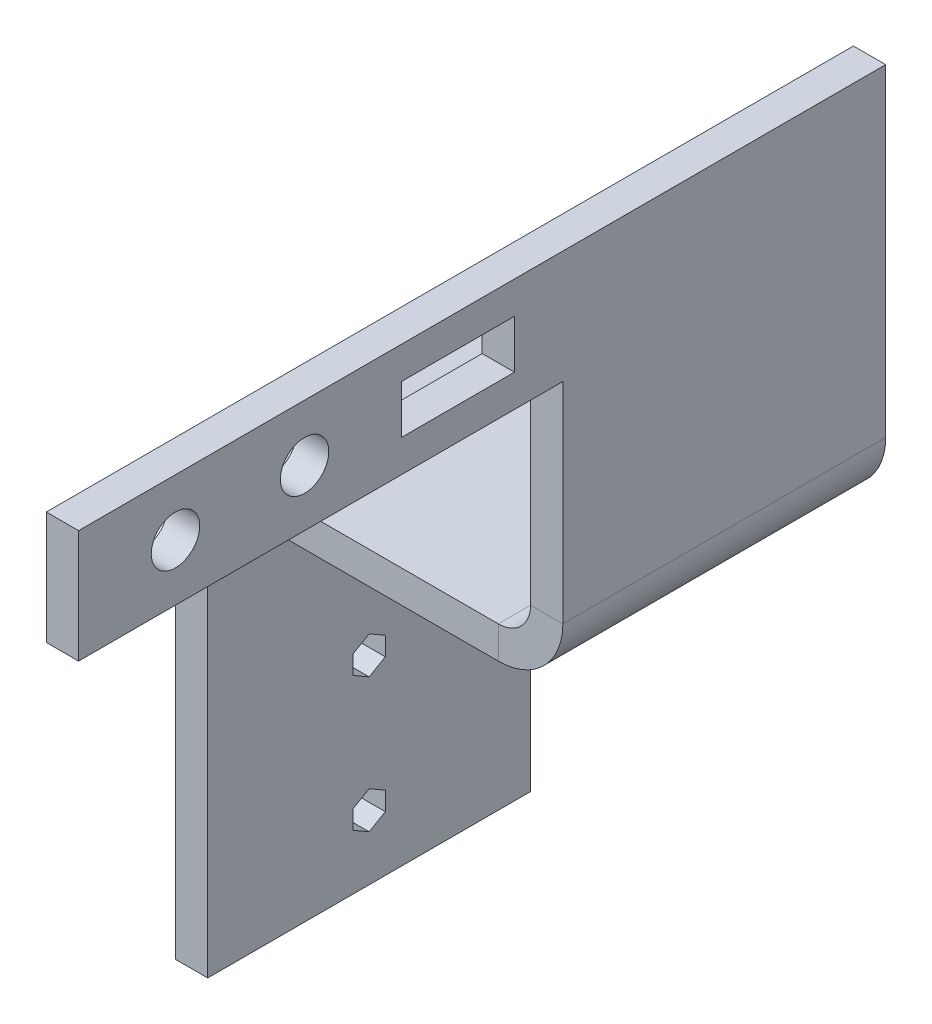
ISO-10303-21;
HEADER;
FILE_DESCRIPTION(('STEP AP214'),'2;1');
FILE_NAME('part.step','',(''),(''),'','','');
FILE_SCHEMA(('AUTOMOTIVE_DESIGN { 1 0 10303 214 1 1 1 1 }'));
ENDSEC;
DATA;
#1=APPLICATION_CONTEXT('core data for automotive mechanical design processes');
#2=APPLICATION_PROTOCOL_DEFINITION('international standard','automotive_design',2000,#1);
#3=PRODUCT_CONTEXT('',#1,'mechanical');
#4=PRODUCT('Part','Part','',(#3));
#5=PRODUCT_RELATED_PRODUCT_CATEGORY('part','',(#4));
#6=PRODUCT_DEFINITION_FORMATION('','',#4);
#7=PRODUCT_DEFINITION_CONTEXT('part definition',#1,'design');
#8=PRODUCT_DEFINITION('design','',#6,#7);
#9=PRODUCT_DEFINITION_SHAPE('','',#8);
#10=(LENGTH_UNIT() NAMED_UNIT(*) SI_UNIT(.MILLI.,.METRE.));
#11=(NAMED_UNIT(*) PLANE_ANGLE_UNIT() SI_UNIT($,.RADIAN.));
#12=(NAMED_UNIT(*) SI_UNIT($,.STERADIAN.) SOLID_ANGLE_UNIT());
#13=UNCERTAINTY_MEASURE_WITH_UNIT(LENGTH_MEASURE(1.E-05),#10,'distance_accuracy_value','');
#14=(GEOMETRIC_REPRESENTATION_CONTEXT(3) GLOBAL_UNCERTAINTY_ASSIGNED_CONTEXT((#13)) GLOBAL_UNIT_ASSIGNED_CONTEXT((#10,
#11,#12)) REPRESENTATION_CONTEXT('',''));
#15=CARTESIAN_POINT('',(0.,0.,0.));
#16=DIRECTION('',(0.,0.,1.));
#17=DIRECTION('',(1.,0.,0.));
#18=AXIS2_PLACEMENT_3D('',#15,#16,#17);
#19=CARTESIAN_POINT('',(12.,0.,10.));
#20=DIRECTION('',(0.,0.,1.));
#21=DIRECTION('',(1.,0.,0.));
#22=AXIS2_PLACEMENT_3D('',#19,#20,#21);
#23=PLANE('',#22);
#24=DIRECTION('',(0.,1.,0.));
#25=VECTOR('',#24,1.);
#26=CARTESIAN_POINT('',(1.,0.,10.));
#27=LINE('',#26,#25);
#28=CARTESIAN_POINT('',(1.,0.,10.));
#29=VERTEX_POINT('',#28);
#30=CARTESIAN_POINT('',(1.,12.,10.));
#31=VERTEX_POINT('',#30);
#32=EDGE_CURVE('E365',#29,#31,#27,.T.);
#33=ORIENTED_EDGE('',*,*,#32,.T.);
#34=DIRECTION('',(-1.,0.,0.));
#35=VECTOR('',#34,1.);
#36=CARTESIAN_POINT('',(1.,12.,10.));
#37=LINE('',#36,#35);
#38=CARTESIAN_POINT('',(0.,12.,10.));
#39=VERTEX_POINT('',#38);
#40=EDGE_CURVE('E474',#31,#39,#37,.T.);
#41=ORIENTED_EDGE('',*,*,#40,.T.);
#42=DIRECTION('',(0.,1.,0.));
#43=VECTOR('',#42,1.);
#44=CARTESIAN_POINT('',(0.,0.,10.));
#45=LINE('',#44,#43);
#46=CARTESIAN_POINT('',(0.,0.,10.));
#47=VERTEX_POINT('',#46);
#48=EDGE_CURVE('E368',#47,#39,#45,.T.);
#49=ORIENTED_EDGE('',*,*,#48,.F.);
#50=DIRECTION('',(-1.,0.,0.));
#51=VECTOR('',#50,1.);
#52=CARTESIAN_POINT('',(12.,0.,10.));
#53=LINE('',#52,#51);
#54=EDGE_CURVE('E356',#29,#47,#53,.T.);
#55=ORIENTED_EDGE('',*,*,#54,.F.);
#56=EDGE_LOOP('',(#33,#41,#49,#55));
#57=FACE_BOUND('',#56,.T.);
#58=ADVANCED_FACE('F43',(#57),#23,.T.);
#59=DIRECTION('',(1.,0.,0.));
#60=VECTOR('',#59,1.);
#61=CARTESIAN_POINT('',(0.,14.,10.));
#62=LINE('',#61,#60);
#63=CARTESIAN_POINT('',(2.,14.,10.));
#64=VERTEX_POINT('',#63);
#65=CARTESIAN_POINT('',(10.,14.,10.));
#66=VERTEX_POINT('',#65);
#67=EDGE_CURVE('E374',#64,#66,#62,.T.);
#68=ORIENTED_EDGE('',*,*,#67,.F.);
#69=DIRECTION('',(0.,-1.,0.));
#70=VECTOR('',#69,1.);
#71=CARTESIAN_POINT('',(2.,14.,10.));
#72=LINE('',#71,#70);
#73=CARTESIAN_POINT('',(2.,13.,10.));
#74=VERTEX_POINT('',#73);
#75=EDGE_CURVE('E472',#64,#74,#72,.T.);
#76=ORIENTED_EDGE('',*,*,#75,.T.);
#77=DIRECTION('',(1.,0.,0.));
#78=VECTOR('',#77,1.);
#79=CARTESIAN_POINT('',(0.,13.,10.));
#80=LINE('',#79,#78);
#81=CARTESIAN_POINT('',(10.,13.,10.));
#82=VERTEX_POINT('',#81);
#83=EDGE_CURVE('E359',#74,#82,#80,.T.);
#84=ORIENTED_EDGE('',*,*,#83,.T.);
#85=DIRECTION('',(0.,1.,0.));
#86=VECTOR('',#85,1.);
#87=CARTESIAN_POINT('',(10.,13.,10.));
#88=LINE('',#87,#86);
#89=EDGE_CURVE('E470',#82,#66,#88,.T.);
#90=ORIENTED_EDGE('',*,*,#89,.T.);
#91=EDGE_LOOP('',(#68,#76,#84,#90));
#92=FACE_BOUND('',#91,.T.);
#93=ADVANCED_FACE('F539',(#92),#23,.T.);
#94=ORIENTED_EDGE('',*,*,#40,.F.);
#95=CARTESIAN_POINT('',(2.,12.,10.));
#96=DIRECTION('',(0.,0.,1.));
#97=DIRECTION('',(1.,0.,0.));
#98=AXIS2_PLACEMENT_3D('',#95,#96,#97);
#99=CIRCLE('',#98,1.);
#100=EDGE_CURVE('E362',#31,#74,#99,.F.);
#101=ORIENTED_EDGE('',*,*,#100,.T.);
#102=ORIENTED_EDGE('',*,*,#75,.F.);
#103=CARTESIAN_POINT('',(2.,12.,10.));
#104=DIRECTION('',(0.,0.,1.));
#105=DIRECTION('',(1.,0.,0.));
#106=AXIS2_PLACEMENT_3D('',#103,#104,#105);
#107=CIRCLE('',#106,2.);
#108=EDGE_CURVE('E371',#39,#64,#107,.F.);
#109=ORIENTED_EDGE('',*,*,#108,.F.);
#110=EDGE_LOOP('',(#94,#101,#102,#109));
#111=FACE_BOUND('',#110,.T.);
#112=ADVANCED_FACE('F547',(#111),#23,.T.);
#113=DIRECTION('',(0.,1.,0.));
#114=VECTOR('',#113,1.);
#115=CARTESIAN_POINT('',(11.,14.,10.));
#116=LINE('',#115,#114);
#117=CARTESIAN_POINT('',(11.,15.,10.));
#118=VERTEX_POINT('',#117);
#119=CARTESIAN_POINT('',(11.,21.5,10.));
#120=VERTEX_POINT('',#119);
#121=EDGE_CURVE('E380',#118,#120,#116,.T.);
#122=ORIENTED_EDGE('',*,*,#121,.F.);
#123=DIRECTION('',(1.,0.,0.));
#124=VECTOR('',#123,1.);
#125=CARTESIAN_POINT('',(11.,15.,10.));
#126=LINE('',#125,#124);
#127=CARTESIAN_POINT('',(12.,15.,10.));
#128=VERTEX_POINT('',#127);
#129=EDGE_CURVE('E468',#118,#128,#126,.T.);
#130=ORIENTED_EDGE('',*,*,#129,.T.);
#131=DIRECTION('',(0.,1.,0.));
#132=VECTOR('',#131,1.);
#133=CARTESIAN_POINT('',(12.,0.,10.));
#134=LINE('',#133,#132);
#135=CARTESIAN_POINT('',(12.,21.5,10.));
#136=VERTEX_POINT('',#135);
#137=EDGE_CURVE('E347',#128,#136,#134,.T.);
#138=ORIENTED_EDGE('',*,*,#137,.T.);
#139=DIRECTION('',(-1.,0.,0.));
#140=VECTOR('',#139,1.);
#141=CARTESIAN_POINT('',(12.,21.5,10.));
#142=LINE('',#141,#140);
#143=EDGE_CURVE('E353',#136,#120,#142,.T.);
#144=ORIENTED_EDGE('',*,*,#143,.T.);
#145=EDGE_LOOP('',(#122,#130,#138,#144));
#146=FACE_BOUND('',#145,.T.);
#147=ADVANCED_FACE('F555',(#146),#23,.T.);
#148=CARTESIAN_POINT('',(10.,13.,25.));
#149=DIRECTION('',(0.,0.,1.));
#150=DIRECTION('',(1.,0.,0.));
#151=AXIS2_PLACEMENT_3D('',#148,#149,#150);
#152=PLANE('',#151);
#153=DIRECTION('',(0.,1.,0.));
#154=VECTOR('',#153,1.);
#155=CARTESIAN_POINT('',(11.,14.,25.));
#156=LINE('',#155,#154);
#157=CARTESIAN_POINT('',(11.,21.5,25.));
#158=VERTEX_POINT('',#157);
#159=CARTESIAN_POINT('',(11.,25.,25.));
#160=VERTEX_POINT('',#159);
#161=EDGE_CURVE('E390',#158,#160,#156,.T.);
#162=ORIENTED_EDGE('',*,*,#161,.F.);
#163=DIRECTION('',(-1.,0.,0.));
#164=VECTOR('',#163,1.);
#165=CARTESIAN_POINT('',(12.,21.5,25.));
#166=LINE('',#165,#164);
#167=CARTESIAN_POINT('',(12.,21.5,25.));
#168=VERTEX_POINT('',#167);
#169=EDGE_CURVE('E351',#168,#158,#166,.T.);
#170=ORIENTED_EDGE('',*,*,#169,.F.);
#171=DIRECTION('',(0.,1.,0.));
#172=VECTOR('',#171,1.);
#173=CARTESIAN_POINT('',(12.,14.,25.));
#174=LINE('',#173,#172);
#175=CARTESIAN_POINT('',(12.,25.,25.));
#176=VERTEX_POINT('',#175);
#177=EDGE_CURVE('E384',#168,#176,#174,.T.);
#178=ORIENTED_EDGE('',*,*,#177,.T.);
#179=DIRECTION('',(1.,0.,0.));
#180=VECTOR('',#179,1.);
#181=CARTESIAN_POINT('',(11.,25.,25.));
#182=LINE('',#181,#180);
#183=EDGE_CURVE('E386',#160,#176,#182,.T.);
#184=ORIENTED_EDGE('',*,*,#183,.F.);
#185=EDGE_LOOP('',(#162,#170,#178,#184));
#186=FACE_BOUND('',#185,.T.);
#187=ADVANCED_FACE('F565',(#186),#152,.T.);
#188=CARTESIAN_POINT('',(12.,14.,25.));
#189=DIRECTION('',(-1.,0.,0.));
#190=DIRECTION('',(0.,0.,1.));
#191=AXIS2_PLACEMENT_3D('',#188,#189,#190);
#192=PLANE('',#191);
#193=CARTESIAN_POINT('',(12.,23.25,22.));
#194=DIRECTION('',(-1.,0.,0.));
#195=DIRECTION('',(0.,0.,1.));
#196=AXIS2_PLACEMENT_3D('',#193,#194,#195);
#197=CIRCLE('',#196,0.750000000000002);
#198=CARTESIAN_POINT('',(12.,23.25,22.75));
#199=VERTEX_POINT('',#198);
#200=EDGE_CURVE('E344',#199,#199,#197,.T.);
#201=ORIENTED_EDGE('',*,*,#200,.T.);
#202=EDGE_LOOP('',(#201));
#203=FACE_BOUND('',#202,.T.);
#204=CARTESIAN_POINT('',(12.,23.25,18.));
#205=DIRECTION('',(-1.,0.,0.));
#206=DIRECTION('',(0.,0.,1.));
#207=AXIS2_PLACEMENT_3D('',#204,#205,#206);
#208=CIRCLE('',#207,0.750000000000002);
#209=CARTESIAN_POINT('',(12.,23.25,18.75));
#210=VERTEX_POINT('',#209);
#211=EDGE_CURVE('E340',#210,#210,#208,.T.);
#212=ORIENTED_EDGE('',*,*,#211,.T.);
#213=EDGE_LOOP('',(#212));
#214=FACE_BOUND('',#213,.T.);
#215=DIRECTION('',(0.,1.,0.));
#216=VECTOR('',#215,1.);
#217=CARTESIAN_POINT('',(12.,14.,15.));
#218=LINE('',#217,#216);
#219=CARTESIAN_POINT('',(12.,22.5,15.));
#220=VERTEX_POINT('',#219);
#221=CARTESIAN_POINT('',(12.,24.,15.));
#222=VERTEX_POINT('',#221);
#223=EDGE_CURVE('E319',#220,#222,#218,.T.);
#224=ORIENTED_EDGE('',*,*,#223,.T.);
#225=DIRECTION('',(0.,0.,-1.));
#226=VECTOR('',#225,1.);
#227=CARTESIAN_POINT('',(12.,24.,25.));
#228=LINE('',#227,#226);
#229=CARTESIAN_POINT('',(12.,24.,11.5));
#230=VERTEX_POINT('',#229);
#231=EDGE_CURVE('E336',#222,#230,#228,.T.);
#232=ORIENTED_EDGE('',*,*,#231,.T.);
#233=DIRECTION('',(0.,-1.,0.));
#234=VECTOR('',#233,1.);
#235=CARTESIAN_POINT('',(12.,14.,11.5));
#236=LINE('',#235,#234);
#237=CARTESIAN_POINT('',(12.,22.5,11.5));
#238=VERTEX_POINT('',#237);
#239=EDGE_CURVE('E333',#230,#238,#236,.T.);
#240=ORIENTED_EDGE('',*,*,#239,.T.);
#241=DIRECTION('',(0.,0.,1.));
#242=VECTOR('',#241,1.);
#243=CARTESIAN_POINT('',(12.,22.5,25.));
#244=LINE('',#243,#242);
#245=EDGE_CURVE('E330',#238,#220,#244,.T.);
#246=ORIENTED_EDGE('',*,*,#245,.T.);
#247=EDGE_LOOP('',(#224,#232,#240,#246));
#248=FACE_BOUND('',#247,.T.);
#249=ORIENTED_EDGE('',*,*,#137,.F.);
#250=DIRECTION('',(0.,0.,-1.));
#251=VECTOR('',#250,1.);
#252=CARTESIAN_POINT('',(12.,15.,25.));
#253=LINE('',#252,#251);
#254=CARTESIAN_POINT('',(12.,15.,0.));
#255=VERTEX_POINT('',#254);
#256=EDGE_CURVE('E392',#128,#255,#253,.T.);
#257=ORIENTED_EDGE('',*,*,#256,.T.);
#258=DIRECTION('',(0.,1.,0.));
#259=VECTOR('',#258,1.);
#260=CARTESIAN_POINT('',(12.,14.,0.));
#261=LINE('',#260,#259);
#262=CARTESIAN_POINT('',(12.,25.,0.));
#263=VERTEX_POINT('',#262);
#264=EDGE_CURVE('E383',#255,#263,#261,.T.);
#265=ORIENTED_EDGE('',*,*,#264,.T.);
#266=DIRECTION('',(0.,0.,-1.));
#267=VECTOR('',#266,1.);
#268=CARTESIAN_POINT('',(12.,25.,25.));
#269=LINE('',#268,#267);
#270=EDGE_CURVE('E448',#176,#263,#269,.T.);
#271=ORIENTED_EDGE('',*,*,#270,.F.);
#272=ORIENTED_EDGE('',*,*,#177,.F.);
#273=DIRECTION('',(0.,0.,1.));
#274=VECTOR('',#273,1.);
#275=CARTESIAN_POINT('',(12.,21.5,25.));
#276=LINE('',#275,#274);
#277=EDGE_CURVE('E349',#136,#168,#276,.T.);
#278=ORIENTED_EDGE('',*,*,#277,.F.);
#279=EDGE_LOOP('',(#249,#257,#265,#271,#272,#278));
#280=FACE_BOUND('',#279,.T.);
#281=ADVANCED_FACE('F571',(#203,#214,#248,#280),#192,.F.);
#282=CARTESIAN_POINT('',(11.,14.,25.));
#283=DIRECTION('',(-1.,0.,0.));
#284=DIRECTION('',(0.,0.,1.));
#285=AXIS2_PLACEMENT_3D('',#282,#283,#284);
#286=PLANE('',#285);
#287=CARTESIAN_POINT('',(11.,23.25,22.));
#288=DIRECTION('',(-1.,0.,0.));
#289=DIRECTION('',(0.,0.,1.));
#290=AXIS2_PLACEMENT_3D('',#287,#288,#289);
#291=CIRCLE('',#290,0.750000000000002);
#292=CARTESIAN_POINT('',(11.,23.25,22.75));
#293=VERTEX_POINT('',#292);
#294=EDGE_CURVE('E343',#293,#293,#291,.T.);
#295=ORIENTED_EDGE('',*,*,#294,.F.);
#296=EDGE_LOOP('',(#295));
#297=FACE_BOUND('',#296,.T.);
#298=CARTESIAN_POINT('',(11.,23.25,18.));
#299=DIRECTION('',(-1.,0.,0.));
#300=DIRECTION('',(0.,0.,1.));
#301=AXIS2_PLACEMENT_3D('',#298,#299,#300);
#302=CIRCLE('',#301,0.750000000000002);
#303=CARTESIAN_POINT('',(11.,23.25,18.75));
#304=VERTEX_POINT('',#303);
#305=EDGE_CURVE('E339',#304,#304,#302,.T.);
#306=ORIENTED_EDGE('',*,*,#305,.F.);
#307=EDGE_LOOP('',(#306));
#308=FACE_BOUND('',#307,.T.);
#309=DIRECTION('',(0.,0.,-1.));
#310=VECTOR('',#309,1.);
#311=CARTESIAN_POINT('',(11.,24.,25.));
#312=LINE('',#311,#310);
#313=CARTESIAN_POINT('',(11.,24.,15.));
#314=VERTEX_POINT('',#313);
#315=CARTESIAN_POINT('',(11.,24.,11.5));
#316=VERTEX_POINT('',#315);
#317=EDGE_CURVE('E483',#314,#316,#312,.T.);
#318=ORIENTED_EDGE('',*,*,#317,.F.);
#319=DIRECTION('',(0.,1.,0.));
#320=VECTOR('',#319,1.);
#321=CARTESIAN_POINT('',(11.,14.,15.));
#322=LINE('',#321,#320);
#323=CARTESIAN_POINT('',(11.,22.5,15.));
#324=VERTEX_POINT('',#323);
#325=EDGE_CURVE('E476',#324,#314,#322,.T.);
#326=ORIENTED_EDGE('',*,*,#325,.F.);
#327=DIRECTION('',(0.,0.,1.));
#328=VECTOR('',#327,1.);
#329=CARTESIAN_POINT('',(11.,22.5,25.));
#330=LINE('',#329,#328);
#331=CARTESIAN_POINT('',(11.,22.5,11.5));
#332=VERTEX_POINT('',#331);
#333=EDGE_CURVE('E478',#332,#324,#330,.T.);
#334=ORIENTED_EDGE('',*,*,#333,.F.);
#335=DIRECTION('',(0.,-1.,0.));
#336=VECTOR('',#335,1.);
#337=CARTESIAN_POINT('',(11.,14.,11.5));
#338=LINE('',#337,#336);
#339=EDGE_CURVE('E481',#316,#332,#338,.T.);
#340=ORIENTED_EDGE('',*,*,#339,.F.);
#341=EDGE_LOOP('',(#318,#326,#334,#340));
#342=FACE_BOUND('',#341,.T.);
#343=DIRECTION('',(0.,0.,-1.));
#344=VECTOR('',#343,1.);
#345=CARTESIAN_POINT('',(11.,15.,25.));
#346=LINE('',#345,#344);
#347=CARTESIAN_POINT('',(11.,15.,0.));
#348=VERTEX_POINT('',#347);
#349=EDGE_CURVE('E444',#118,#348,#346,.T.);
#350=ORIENTED_EDGE('',*,*,#349,.F.);
#351=ORIENTED_EDGE('',*,*,#121,.T.);
#352=DIRECTION('',(0.,0.,1.));
#353=VECTOR('',#352,1.);
#354=CARTESIAN_POINT('',(11.,21.5,25.));
#355=LINE('',#354,#353);
#356=EDGE_CURVE('E465',#120,#158,#355,.T.);
#357=ORIENTED_EDGE('',*,*,#356,.T.);
#358=ORIENTED_EDGE('',*,*,#161,.T.);
#359=DIRECTION('',(0.,0.,-1.));
#360=VECTOR('',#359,1.);
#361=CARTESIAN_POINT('',(11.,25.,25.));
#362=LINE('',#361,#360);
#363=CARTESIAN_POINT('',(11.,25.,0.));
#364=VERTEX_POINT('',#363);
#365=EDGE_CURVE('E446',#160,#364,#362,.T.);
#366=ORIENTED_EDGE('',*,*,#365,.T.);
#367=DIRECTION('',(0.,1.,0.));
#368=VECTOR('',#367,1.);
#369=CARTESIAN_POINT('',(11.,14.,0.));
#370=LINE('',#369,#368);
#371=EDGE_CURVE('E398',#348,#364,#370,.T.);
#372=ORIENTED_EDGE('',*,*,#371,.F.);
#373=EDGE_LOOP('',(#350,#351,#357,#358,#366,#372));
#374=FACE_BOUND('',#373,.T.);
#375=ADVANCED_FACE('F585',(#297,#308,#342,#374),#286,.T.);
#376=CARTESIAN_POINT('',(10.,15.,25.));
#377=DIRECTION('',(0.,0.,-1.));
#378=DIRECTION('',(-1.,0.,0.));
#379=AXIS2_PLACEMENT_3D('',#376,#377,#378);
#380=CYLINDRICAL_SURFACE('',#379,1.);
#381=DIRECTION('',(0.,0.,-1.));
#382=VECTOR('',#381,1.);
#383=CARTESIAN_POINT('',(10.,14.,25.));
#384=LINE('',#383,#382);
#385=CARTESIAN_POINT('',(10.,14.,0.));
#386=VERTEX_POINT('',#385);
#387=EDGE_CURVE('E442',#66,#386,#384,.T.);
#388=ORIENTED_EDGE('',*,*,#387,.F.);
#389=CARTESIAN_POINT('',(10.,15.,10.));
#390=DIRECTION('',(0.,0.,1.));
#391=DIRECTION('',(1.,0.,0.));
#392=AXIS2_PLACEMENT_3D('',#389,#390,#391);
#393=CIRCLE('',#392,1.);
#394=EDGE_CURVE('E377',#66,#118,#393,.T.);
#395=ORIENTED_EDGE('',*,*,#394,.T.);
#396=ORIENTED_EDGE('',*,*,#349,.T.);
#397=CARTESIAN_POINT('',(10.,15.,0.));
#398=DIRECTION('',(0.,0.,-1.));
#399=DIRECTION('',(-1.,0.,0.));
#400=AXIS2_PLACEMENT_3D('',#397,#398,#399);
#401=CIRCLE('',#400,1.);
#402=EDGE_CURVE('E401',#386,#348,#401,.F.);
#403=ORIENTED_EDGE('',*,*,#402,.F.);
#404=EDGE_LOOP('',(#388,#395,#396,#403));
#405=FACE_BOUND('',#404,.T.);
#406=ADVANCED_FACE('F582',(#405),#380,.F.);
#407=CARTESIAN_POINT('',(0.,14.,25.));
#408=DIRECTION('',(0.,1.,0.));
#409=DIRECTION('',(-1.,0.,0.));
#410=AXIS2_PLACEMENT_3D('',#407,#408,#409);
#411=PLANE('',#410);
#412=DIRECTION('',(0.,0.,-1.));
#413=VECTOR('',#412,1.);
#414=CARTESIAN_POINT('',(2.,14.,25.));
#415=LINE('',#414,#413);
#416=CARTESIAN_POINT('',(2.,14.,0.));
#417=VERTEX_POINT('',#416);
#418=EDGE_CURVE('E440',#64,#417,#415,.T.);
#419=ORIENTED_EDGE('',*,*,#418,.F.);
#420=ORIENTED_EDGE('',*,*,#67,.T.);
#421=ORIENTED_EDGE('',*,*,#387,.T.);
#422=DIRECTION('',(1.,0.,0.));
#423=VECTOR('',#422,1.);
#424=CARTESIAN_POINT('',(0.,14.,0.));
#425=LINE('',#424,#423);
#426=EDGE_CURVE('E404',#417,#386,#425,.T.);
#427=ORIENTED_EDGE('',*,*,#426,.F.);
#428=EDGE_LOOP('',(#419,#420,#421,#427));
#429=FACE_BOUND('',#428,.T.);
#430=ADVANCED_FACE('F600',(#429),#411,.T.);
#431=CARTESIAN_POINT('',(2.,12.,25.));
#432=DIRECTION('',(0.,0.,-1.));
#433=DIRECTION('',(-1.,0.,0.));
#434=AXIS2_PLACEMENT_3D('',#431,#432,#433);
#435=CYLINDRICAL_SURFACE('',#434,2.);
#436=DIRECTION('',(0.,0.,-1.));
#437=VECTOR('',#436,1.);
#438=CARTESIAN_POINT('',(0.,12.,25.));
#439=LINE('',#438,#437);
#440=CARTESIAN_POINT('',(0.,12.,0.));
#441=VERTEX_POINT('',#440);
#442=EDGE_CURVE('E438',#39,#441,#439,.T.);
#443=ORIENTED_EDGE('',*,*,#442,.F.);
#444=ORIENTED_EDGE('',*,*,#108,.T.);
#445=ORIENTED_EDGE('',*,*,#418,.T.);
#446=CARTESIAN_POINT('',(2.,12.,0.));
#447=DIRECTION('',(0.,0.,1.));
#448=DIRECTION('',(1.,0.,0.));
#449=AXIS2_PLACEMENT_3D('',#446,#447,#448);
#450=CIRCLE('',#449,2.);
#451=EDGE_CURVE('E407',#441,#417,#450,.F.);
#452=ORIENTED_EDGE('',*,*,#451,.F.);
#453=EDGE_LOOP('',(#443,#444,#445,#452));
#454=FACE_BOUND('',#453,.T.);
#455=ADVANCED_FACE('F607',(#454),#435,.T.);
#456=CARTESIAN_POINT('',(0.,0.,25.));
#457=DIRECTION('',(-1.,0.,0.));
#458=DIRECTION('',(0.,0.,1.));
#459=AXIS2_PLACEMENT_3D('',#456,#457,#458);
#460=PLANE('',#459);
#461=DIRECTION('',(0.,0.499999999999998,0.86602540378444));
#462=VECTOR('',#461,1.);
#463=CARTESIAN_POINT('',(0.,2.28867513459482,4.5));
#464=LINE('',#463,#462);
#465=CARTESIAN_POINT('',(0.,2.28867513459482,4.5));
#466=VERTEX_POINT('',#465);
#467=CARTESIAN_POINT('',(0.,2.57735026918963,5.));
#468=VERTEX_POINT('',#467);
#469=EDGE_CURVE('E247',#466,#468,#464,.T.);
#470=ORIENTED_EDGE('',*,*,#469,.T.);
#471=DIRECTION('',(0.,-0.500000000000002,0.866025403784437));
#472=VECTOR('',#471,1.);
#473=CARTESIAN_POINT('',(0.,2.57735026918963,5.));
#474=LINE('',#473,#472);
#475=CARTESIAN_POINT('',(0.,2.28867513459481,5.5));
#476=VERTEX_POINT('',#475);
#477=EDGE_CURVE('E255',#468,#476,#474,.T.);
#478=ORIENTED_EDGE('',*,*,#477,.T.);
#479=DIRECTION('',(0.,-1.,0.));
#480=VECTOR('',#479,1.);
#481=CARTESIAN_POINT('',(0.,2.28867513459481,5.5));
#482=LINE('',#481,#480);
#483=CARTESIAN_POINT('',(0.,1.71132486540519,5.5));
#484=VERTEX_POINT('',#483);
#485=EDGE_CURVE('E58',#476,#484,#482,.T.);
#486=ORIENTED_EDGE('',*,*,#485,.T.);
#487=DIRECTION('',(0.,-0.499999999999999,-0.866025403784439));
#488=VECTOR('',#487,1.);
#489=CARTESIAN_POINT('',(0.,1.71132486540519,5.5));
#490=LINE('',#489,#488);
#491=CARTESIAN_POINT('',(0.,1.42264973081038,5.));
#492=VERTEX_POINT('',#491);
#493=EDGE_CURVE('E270',#484,#492,#490,.T.);
#494=ORIENTED_EDGE('',*,*,#493,.T.);
#495=DIRECTION('',(0.,0.5,-0.866025403784439));
#496=VECTOR('',#495,1.);
#497=CARTESIAN_POINT('',(0.,1.42264973081038,5.));
#498=LINE('',#497,#496);
#499=CARTESIAN_POINT('',(0.,1.71132486540519,4.5));
#500=VERTEX_POINT('',#499);
#501=EDGE_CURVE('E273',#492,#500,#498,.T.);
#502=ORIENTED_EDGE('',*,*,#501,.T.);
#503=DIRECTION('',(0.,1.,0.));
#504=VECTOR('',#503,1.);
#505=CARTESIAN_POINT('',(0.,1.71132486540519,4.5));
#506=LINE('',#505,#504);
#507=EDGE_CURVE('E252',#500,#466,#506,.T.);
#508=ORIENTED_EDGE('',*,*,#507,.T.);
#509=EDGE_LOOP('',(#470,#478,#486,#494,#502,#508));
#510=FACE_BOUND('',#509,.T.);
#511=DIRECTION('',(0.,0.499999999999997,0.866025403784441));
#512=VECTOR('',#511,1.);
#513=CARTESIAN_POINT('',(0.,6.44337567297406,4.5));
#514=LINE('',#513,#512);
#515=CARTESIAN_POINT('',(0.,6.44337567297406,4.5));
#516=VERTEX_POINT('',#515);
#517=CARTESIAN_POINT('',(0.,6.73205080756887,5.));
#518=VERTEX_POINT('',#517);
#519=EDGE_CURVE('E263',#516,#518,#514,.T.);
#520=ORIENTED_EDGE('',*,*,#519,.T.);
#521=DIRECTION('',(0.,-0.5,0.866025403784439));
#522=VECTOR('',#521,1.);
#523=CARTESIAN_POINT('',(0.,6.73205080756887,5.));
#524=LINE('',#523,#522);
#525=CARTESIAN_POINT('',(0.,6.44337567297406,5.5));
#526=VERTEX_POINT('',#525);
#527=EDGE_CURVE('E266',#518,#526,#524,.T.);
#528=ORIENTED_EDGE('',*,*,#527,.T.);
#529=DIRECTION('',(0.,-1.,0.));
#530=VECTOR('',#529,1.);
#531=CARTESIAN_POINT('',(0.,6.44337567297406,5.5));
#532=LINE('',#531,#530);
#533=CARTESIAN_POINT('',(0.,5.86602540378444,5.5));
#534=VERTEX_POINT('',#533);
#535=EDGE_CURVE('E66',#526,#534,#532,.T.);
#536=ORIENTED_EDGE('',*,*,#535,.T.);
#537=DIRECTION('',(0.,-0.499999999999998,-0.86602540378444));
#538=VECTOR('',#537,1.);
#539=CARTESIAN_POINT('',(0.,5.86602540378444,5.5));
#540=LINE('',#539,#538);
#541=CARTESIAN_POINT('',(0.,5.57735026918963,5.));
#542=VERTEX_POINT('',#541);
#543=EDGE_CURVE('E311',#534,#542,#540,.T.);
#544=ORIENTED_EDGE('',*,*,#543,.T.);
#545=DIRECTION('',(0.,0.499999999999999,-0.866025403784439));
#546=VECTOR('',#545,1.);
#547=CARTESIAN_POINT('',(0.,5.57735026918963,5.));
#548=LINE('',#547,#546);
#549=CARTESIAN_POINT('',(0.,5.86602540378444,4.5));
#550=VERTEX_POINT('',#549);
#551=EDGE_CURVE('E308',#542,#550,#548,.T.);
#552=ORIENTED_EDGE('',*,*,#551,.T.);
#553=DIRECTION('',(0.,1.,0.));
#554=VECTOR('',#553,1.);
#555=CARTESIAN_POINT('',(0.,5.86602540378444,4.5));
#556=LINE('',#555,#554);
#557=EDGE_CURVE('E291',#550,#516,#556,.T.);
#558=ORIENTED_EDGE('',*,*,#557,.T.);
#559=EDGE_LOOP('',(#520,#528,#536,#544,#552,#558));
#560=FACE_BOUND('',#559,.T.);
#561=DIRECTION('',(0.,0.,-1.));
#562=VECTOR('',#561,1.);
#563=CARTESIAN_POINT('',(0.,0.,25.));
#564=LINE('',#563,#562);
#565=CARTESIAN_POINT('',(0.,0.,0.));
#566=VERTEX_POINT('',#565);
#567=EDGE_CURVE('E436',#47,#566,#564,.T.);
#568=ORIENTED_EDGE('',*,*,#567,.F.);
#569=ORIENTED_EDGE('',*,*,#48,.T.);
#570=ORIENTED_EDGE('',*,*,#442,.T.);
#571=DIRECTION('',(0.,1.,0.));
#572=VECTOR('',#571,1.);
#573=CARTESIAN_POINT('',(0.,0.,0.));
#574=LINE('',#573,#572);
#575=EDGE_CURVE('E410',#566,#441,#574,.T.);
#576=ORIENTED_EDGE('',*,*,#575,.F.);
#577=EDGE_LOOP('',(#568,#569,#570,#576));
#578=FACE_BOUND('',#577,.T.);
#579=ADVANCED_FACE('F259',(#510,#560,#578),#460,.T.);
#580=CARTESIAN_POINT('',(1.,0.,25.));
#581=DIRECTION('',(0.,-1.,0.));
#582=DIRECTION('',(0.,0.,-1.));
#583=AXIS2_PLACEMENT_3D('',#580,#581,#582);
#584=PLANE('',#583);
#585=DIRECTION('',(0.,0.,-1.));
#586=VECTOR('',#585,1.);
#587=CARTESIAN_POINT('',(1.,0.,25.));
#588=LINE('',#587,#586);
#589=CARTESIAN_POINT('',(1.,0.,0.));
#590=VERTEX_POINT('',#589);
#591=EDGE_CURVE('E434',#29,#590,#588,.T.);
#592=ORIENTED_EDGE('',*,*,#591,.F.);
#593=ORIENTED_EDGE('',*,*,#54,.T.);
#594=ORIENTED_EDGE('',*,*,#567,.T.);
#595=DIRECTION('',(-1.,0.,0.));
#596=VECTOR('',#595,1.);
#597=CARTESIAN_POINT('',(1.,0.,0.));
#598=LINE('',#597,#596);
#599=EDGE_CURVE('E413',#590,#566,#598,.T.);
#600=ORIENTED_EDGE('',*,*,#599,.F.);
#601=EDGE_LOOP('',(#592,#593,#594,#600));
#602=FACE_BOUND('',#601,.T.);
#603=ADVANCED_FACE('F619',(#602),#584,.T.);
#604=CARTESIAN_POINT('',(1.,0.,25.));
#605=DIRECTION('',(-1.,0.,0.));
#606=DIRECTION('',(0.,0.,1.));
#607=AXIS2_PLACEMENT_3D('',#604,#605,#606);
#608=PLANE('',#607);
#609=DIRECTION('',(0.,0.500000000000002,-0.866025403784438));
#610=VECTOR('',#609,1.);
#611=CARTESIAN_POINT('',(1.,-6.72724133595219,21.1160254037844));
#612=LINE('',#611,#610);
#613=CARTESIAN_POINT('',(1.,2.28867513459481,5.5));
#614=VERTEX_POINT('',#613);
#615=CARTESIAN_POINT('',(1.,2.57735026918963,5.));
#616=VERTEX_POINT('',#615);
#617=EDGE_CURVE('E507',#614,#616,#612,.T.);
#618=ORIENTED_EDGE('',*,*,#617,.T.);
#619=DIRECTION('',(0.,-0.499999999999998,-0.86602540378444));
#620=VECTOR('',#619,1.);
#621=CARTESIAN_POINT('',(1.,10.5932667397366,18.8839745962156));
#622=LINE('',#621,#620);
#623=CARTESIAN_POINT('',(1.,2.28867513459482,4.5));
#624=VERTEX_POINT('',#623);
#625=EDGE_CURVE('E11',#616,#624,#622,.T.);
#626=ORIENTED_EDGE('',*,*,#625,.T.);
#627=DIRECTION('',(0.,-1.,0.));
#628=VECTOR('',#627,1.);
#629=CARTESIAN_POINT('',(1.,0.,4.5));
#630=LINE('',#629,#628);
#631=CARTESIAN_POINT('',(1.,1.71132486540519,4.5));
#632=VERTEX_POINT('',#631);
#633=EDGE_CURVE('E51',#624,#632,#630,.T.);
#634=ORIENTED_EDGE('',*,*,#633,.T.);
#635=DIRECTION('',(0.,-0.5,0.866025403784439));
#636=VECTOR('',#635,1.);
#637=CARTESIAN_POINT('',(1.,-7.59326673973661,20.6160254037844));
#638=LINE('',#637,#636);
#639=CARTESIAN_POINT('',(1.,1.42264973081038,5.));
#640=VERTEX_POINT('',#639);
#641=EDGE_CURVE('E515',#632,#640,#638,.T.);
#642=ORIENTED_EDGE('',*,*,#641,.T.);
#643=DIRECTION('',(0.,0.499999999999999,0.866025403784439));
#644=VECTOR('',#643,1.);
#645=CARTESIAN_POINT('',(1.,9.72724133595216,19.3839745962156));
#646=LINE('',#645,#644);
#647=CARTESIAN_POINT('',(1.,1.71132486540519,5.5));
#648=VERTEX_POINT('',#647);
#649=EDGE_CURVE('E512',#640,#648,#646,.T.);
#650=ORIENTED_EDGE('',*,*,#649,.T.);
#651=DIRECTION('',(0.,1.,0.));
#652=VECTOR('',#651,1.);
#653=CARTESIAN_POINT('',(1.,0.,5.5));
#654=LINE('',#653,#652);
#655=EDGE_CURVE('E509',#648,#614,#654,.T.);
#656=ORIENTED_EDGE('',*,*,#655,.T.);
#657=EDGE_LOOP('',(#618,#626,#634,#642,#650,#656));
#658=FACE_BOUND('',#657,.T.);
#659=DIRECTION('',(0.,0.5,-0.866025403784439));
#660=VECTOR('',#659,1.);
#661=CARTESIAN_POINT('',(1.,-3.61121593216774,22.9150635094611));
#662=LINE('',#661,#660);
#663=CARTESIAN_POINT('',(1.,6.44337567297406,5.5));
#664=VERTEX_POINT('',#663);
#665=CARTESIAN_POINT('',(1.,6.73205080756888,5.));
#666=VERTEX_POINT('',#665);
#667=EDGE_CURVE('E485',#664,#666,#662,.T.);
#668=ORIENTED_EDGE('',*,*,#667,.T.);
#669=DIRECTION('',(0.,-0.499999999999997,-0.866025403784441));
#670=VECTOR('',#669,1.);
#671=CARTESIAN_POINT('',(1.,13.709292143521,17.084936490539));
#672=LINE('',#671,#670);
#673=CARTESIAN_POINT('',(1.,6.44337567297406,4.5));
#674=VERTEX_POINT('',#673);
#675=EDGE_CURVE('E504',#666,#674,#672,.T.);
#676=ORIENTED_EDGE('',*,*,#675,.T.);
#677=DIRECTION('',(0.,-1.,0.));
#678=VECTOR('',#677,1.);
#679=CARTESIAN_POINT('',(1.,0.,4.5));
#680=LINE('',#679,#678);
#681=CARTESIAN_POINT('',(1.,5.86602540378444,4.5));
#682=VERTEX_POINT('',#681);
#683=EDGE_CURVE('E501',#674,#682,#680,.T.);
#684=ORIENTED_EDGE('',*,*,#683,.T.);
#685=DIRECTION('',(0.,-0.499999999999999,0.866025403784439));
#686=VECTOR('',#685,1.);
#687=CARTESIAN_POINT('',(1.,-4.47724133595215,22.4150635094611));
#688=LINE('',#687,#686);
#689=CARTESIAN_POINT('',(1.,5.57735026918963,5.));
#690=VERTEX_POINT('',#689);
#691=EDGE_CURVE('E498',#682,#690,#688,.T.);
#692=ORIENTED_EDGE('',*,*,#691,.T.);
#693=DIRECTION('',(0.,0.499999999999998,0.86602540378444));
#694=VECTOR('',#693,1.);
#695=CARTESIAN_POINT('',(1.,12.8432667397366,17.584936490539));
#696=LINE('',#695,#694);
#697=CARTESIAN_POINT('',(1.,5.86602540378444,5.5));
#698=VERTEX_POINT('',#697);
#699=EDGE_CURVE('E495',#690,#698,#696,.T.);
#700=ORIENTED_EDGE('',*,*,#699,.T.);
#701=DIRECTION('',(0.,1.,0.));
#702=VECTOR('',#701,1.);
#703=CARTESIAN_POINT('',(1.,0.,5.5));
#704=LINE('',#703,#702);
#705=EDGE_CURVE('E492',#698,#664,#704,.T.);
#706=ORIENTED_EDGE('',*,*,#705,.T.);
#707=EDGE_LOOP('',(#668,#676,#684,#692,#700,#706));
#708=FACE_BOUND('',#707,.T.);
#709=ORIENTED_EDGE('',*,*,#32,.F.);
#710=ORIENTED_EDGE('',*,*,#591,.T.);
#711=DIRECTION('',(0.,1.,0.));
#712=VECTOR('',#711,1.);
#713=CARTESIAN_POINT('',(1.,0.,0.));
#714=LINE('',#713,#712);
#715=CARTESIAN_POINT('',(1.,12.,0.));
#716=VERTEX_POINT('',#715);
#717=EDGE_CURVE('E416',#590,#716,#714,.T.);
#718=ORIENTED_EDGE('',*,*,#717,.T.);
#719=DIRECTION('',(0.,0.,-1.));
#720=VECTOR('',#719,1.);
#721=CARTESIAN_POINT('',(1.,12.,25.));
#722=LINE('',#721,#720);
#723=EDGE_CURVE('E432',#31,#716,#722,.T.);
#724=ORIENTED_EDGE('',*,*,#723,.F.);
#725=EDGE_LOOP('',(#709,#710,#718,#724));
#726=FACE_BOUND('',#725,.T.);
#727=ADVANCED_FACE('F519',(#658,#708,#726),#608,.F.);
#728=CARTESIAN_POINT('',(2.,12.,25.));
#729=DIRECTION('',(0.,0.,-1.));
#730=DIRECTION('',(-1.,0.,0.));
#731=AXIS2_PLACEMENT_3D('',#728,#729,#730);
#732=CYLINDRICAL_SURFACE('',#731,1.);
#733=ORIENTED_EDGE('',*,*,#100,.F.);
#734=ORIENTED_EDGE('',*,*,#723,.T.);
#735=CARTESIAN_POINT('',(2.,12.,0.));
#736=DIRECTION('',(0.,0.,1.));
#737=DIRECTION('',(0.,1.,0.));
#738=AXIS2_PLACEMENT_3D('',#735,#736,#737);
#739=CIRCLE('',#738,1.);
#740=CARTESIAN_POINT('',(2.,13.,0.));
#741=VERTEX_POINT('',#740);
#742=EDGE_CURVE('E419',#716,#741,#739,.F.);
#743=ORIENTED_EDGE('',*,*,#742,.T.);
#744=DIRECTION('',(0.,0.,-1.));
#745=VECTOR('',#744,1.);
#746=CARTESIAN_POINT('',(2.,13.,25.));
#747=LINE('',#746,#745);
#748=EDGE_CURVE('E430',#74,#741,#747,.T.);
#749=ORIENTED_EDGE('',*,*,#748,.F.);
#750=EDGE_LOOP('',(#733,#734,#743,#749));
#751=FACE_BOUND('',#750,.T.);
#752=ADVANCED_FACE('F625',(#751),#732,.F.);
#753=CARTESIAN_POINT('',(0.,13.,25.));
#754=DIRECTION('',(0.,1.,0.));
#755=DIRECTION('',(-1.,0.,0.));
#756=AXIS2_PLACEMENT_3D('',#753,#754,#755);
#757=PLANE('',#756);
#758=ORIENTED_EDGE('',*,*,#83,.F.);
#759=ORIENTED_EDGE('',*,*,#748,.T.);
#760=DIRECTION('',(1.,0.,0.));
#761=VECTOR('',#760,1.);
#762=CARTESIAN_POINT('',(0.,13.,0.));
#763=LINE('',#762,#761);
#764=CARTESIAN_POINT('',(10.,13.,0.));
#765=VERTEX_POINT('',#764);
#766=EDGE_CURVE('E422',#741,#765,#763,.T.);
#767=ORIENTED_EDGE('',*,*,#766,.T.);
#768=DIRECTION('',(0.,0.,-1.));
#769=VECTOR('',#768,1.);
#770=CARTESIAN_POINT('',(10.,13.,25.));
#771=LINE('',#770,#769);
#772=EDGE_CURVE('E428',#82,#765,#771,.T.);
#773=ORIENTED_EDGE('',*,*,#772,.F.);
#774=EDGE_LOOP('',(#758,#759,#767,#773));
#775=FACE_BOUND('',#774,.T.);
#776=ADVANCED_FACE('F630',(#775),#757,.F.);
#777=CARTESIAN_POINT('',(10.,15.,25.));
#778=DIRECTION('',(0.,0.,-1.));
#779=DIRECTION('',(-1.,0.,0.));
#780=AXIS2_PLACEMENT_3D('',#777,#778,#779);
#781=CYLINDRICAL_SURFACE('',#780,2.);
#782=CARTESIAN_POINT('',(10.,15.,10.));
#783=DIRECTION('',(0.,0.,1.));
#784=DIRECTION('',(1.,0.,0.));
#785=AXIS2_PLACEMENT_3D('',#782,#783,#784);
#786=CIRCLE('',#785,2.);
#787=EDGE_CURVE('E462',#82,#128,#786,.T.);
#788=ORIENTED_EDGE('',*,*,#787,.F.);
#789=ORIENTED_EDGE('',*,*,#772,.T.);
#790=CARTESIAN_POINT('',(10.,15.,0.));
#791=DIRECTION('',(0.,0.,1.));
#792=DIRECTION('',(0.,1.,0.));
#793=AXIS2_PLACEMENT_3D('',#790,#791,#792);
#794=CIRCLE('',#793,2.);
#795=EDGE_CURVE('E387',#765,#255,#794,.T.);
#796=ORIENTED_EDGE('',*,*,#795,.T.);
#797=ORIENTED_EDGE('',*,*,#256,.F.);
#798=EDGE_LOOP('',(#788,#789,#796,#797));
#799=FACE_BOUND('',#798,.T.);
#800=ADVANCED_FACE('F634',(#799),#781,.T.);
#801=CARTESIAN_POINT('',(0.,12.,0.));
#802=DIRECTION('',(0.,0.,-1.));
#803=DIRECTION('',(-1.,0.,0.));
#804=AXIS2_PLACEMENT_3D('',#801,#802,#803);
#805=PLANE('',#804);
#806=DIRECTION('',(1.,0.,0.));
#807=VECTOR('',#806,1.);
#808=CARTESIAN_POINT('',(0.,12.,0.));
#809=LINE('',#808,#807);
#810=EDGE_CURVE('E459',#441,#716,#809,.T.);
#811=ORIENTED_EDGE('',*,*,#810,.F.);
#812=ORIENTED_EDGE('',*,*,#451,.T.);
#813=DIRECTION('',(0.,1.,0.));
#814=VECTOR('',#813,1.);
#815=CARTESIAN_POINT('',(2.,13.,0.));
#816=LINE('',#815,#814);
#817=EDGE_CURVE('E456',#741,#417,#816,.T.);
#818=ORIENTED_EDGE('',*,*,#817,.F.);
#819=ORIENTED_EDGE('',*,*,#742,.F.);
#820=EDGE_LOOP('',(#811,#812,#818,#819));
#821=FACE_BOUND('',#820,.T.);
#822=ADVANCED_FACE('F45',(#821),#805,.T.);
#823=CARTESIAN_POINT('',(2.,13.,0.));
#824=DIRECTION('',(0.,0.,-1.));
#825=DIRECTION('',(-1.,0.,0.));
#826=AXIS2_PLACEMENT_3D('',#823,#824,#825);
#827=PLANE('',#826);
#828=ORIENTED_EDGE('',*,*,#575,.T.);
#829=ORIENTED_EDGE('',*,*,#810,.T.);
#830=ORIENTED_EDGE('',*,*,#717,.F.);
#831=ORIENTED_EDGE('',*,*,#599,.T.);
#832=EDGE_LOOP('',(#828,#829,#830,#831));
#833=FACE_BOUND('',#832,.T.);
#834=ADVANCED_FACE('F610',(#833),#827,.T.);
#835=CARTESIAN_POINT('',(10.,14.,0.));
#836=DIRECTION('',(0.,0.,-1.));
#837=DIRECTION('',(-1.,0.,0.));
#838=AXIS2_PLACEMENT_3D('',#835,#836,#837);
#839=PLANE('',#838);
#840=DIRECTION('',(0.,-1.,0.));
#841=VECTOR('',#840,1.);
#842=CARTESIAN_POINT('',(10.,14.,0.));
#843=LINE('',#842,#841);
#844=EDGE_CURVE('E453',#386,#765,#843,.T.);
#845=ORIENTED_EDGE('',*,*,#844,.F.);
#846=ORIENTED_EDGE('',*,*,#402,.T.);
#847=DIRECTION('',(-1.,0.,0.));
#848=VECTOR('',#847,1.);
#849=CARTESIAN_POINT('',(12.,15.,0.));
#850=LINE('',#849,#848);
#851=EDGE_CURVE('E450',#255,#348,#850,.T.);
#852=ORIENTED_EDGE('',*,*,#851,.F.);
#853=ORIENTED_EDGE('',*,*,#795,.F.);
#854=EDGE_LOOP('',(#845,#846,#852,#853));
#855=FACE_BOUND('',#854,.T.);
#856=ADVANCED_FACE('F591',(#855),#839,.T.);
#857=CARTESIAN_POINT('',(12.,15.,0.));
#858=DIRECTION('',(0.,0.,-1.));
#859=DIRECTION('',(-1.,0.,0.));
#860=AXIS2_PLACEMENT_3D('',#857,#858,#859);
#861=PLANE('',#860);
#862=ORIENTED_EDGE('',*,*,#426,.T.);
#863=ORIENTED_EDGE('',*,*,#844,.T.);
#864=ORIENTED_EDGE('',*,*,#766,.F.);
#865=ORIENTED_EDGE('',*,*,#817,.T.);
#866=EDGE_LOOP('',(#862,#863,#864,#865));
#867=FACE_BOUND('',#866,.T.);
#868=ADVANCED_FACE('F595',(#867),#861,.T.);
#869=CARTESIAN_POINT('',(11.,25.,25.));
#870=DIRECTION('',(0.,1.,0.));
#871=DIRECTION('',(0.,0.,1.));
#872=AXIS2_PLACEMENT_3D('',#869,#870,#871);
#873=PLANE('',#872);
#874=DIRECTION('',(1.,0.,0.));
#875=VECTOR('',#874,1.);
#876=CARTESIAN_POINT('',(11.,25.,0.));
#877=LINE('',#876,#875);
#878=EDGE_CURVE('E395',#364,#263,#877,.T.);
#879=ORIENTED_EDGE('',*,*,#878,.F.);
#880=ORIENTED_EDGE('',*,*,#365,.F.);
#881=ORIENTED_EDGE('',*,*,#183,.T.);
#882=ORIENTED_EDGE('',*,*,#270,.T.);
#883=EDGE_LOOP('',(#879,#880,#881,#882));
#884=FACE_BOUND('',#883,.T.);
#885=ADVANCED_FACE('F562',(#884),#873,.T.);
#886=CARTESIAN_POINT('',(10.,15.,0.));
#887=DIRECTION('',(0.,0.,-1.));
#888=DIRECTION('',(0.,-1.,0.));
#889=AXIS2_PLACEMENT_3D('',#886,#887,#888);
#890=PLANE('',#889);
#891=ORIENTED_EDGE('',*,*,#264,.F.);
#892=ORIENTED_EDGE('',*,*,#851,.T.);
#893=ORIENTED_EDGE('',*,*,#371,.T.);
#894=ORIENTED_EDGE('',*,*,#878,.T.);
#895=EDGE_LOOP('',(#891,#892,#893,#894));
#896=FACE_BOUND('',#895,.T.);
#897=ADVANCED_FACE('F553',(#896),#890,.T.);
#898=ORIENTED_EDGE('',*,*,#89,.F.);
#899=ORIENTED_EDGE('',*,*,#787,.T.);
#900=ORIENTED_EDGE('',*,*,#129,.F.);
#901=ORIENTED_EDGE('',*,*,#394,.F.);
#902=EDGE_LOOP('',(#898,#899,#900,#901));
#903=FACE_BOUND('',#902,.T.);
#904=ADVANCED_FACE('F542',(#903),#23,.T.);
#905=CARTESIAN_POINT('',(12.,21.5,25.));
#906=DIRECTION('',(0.,-1.,0.));
#907=DIRECTION('',(0.,0.,-1.));
#908=AXIS2_PLACEMENT_3D('',#905,#906,#907);
#909=PLANE('',#908);
#910=ORIENTED_EDGE('',*,*,#143,.F.);
#911=ORIENTED_EDGE('',*,*,#277,.T.);
#912=ORIENTED_EDGE('',*,*,#169,.T.);
#913=ORIENTED_EDGE('',*,*,#356,.F.);
#914=EDGE_LOOP('',(#910,#911,#912,#913));
#915=FACE_BOUND('',#914,.T.);
#916=ADVANCED_FACE('F552',(#915),#909,.T.);
#917=CARTESIAN_POINT('',(0.,24.,11.5));
#918=DIRECTION('',(0.,1.,0.));
#919=DIRECTION('',(0.,0.,1.));
#920=AXIS2_PLACEMENT_3D('',#917,#918,#919);
#921=PLANE('',#920);
#922=DIRECTION('',(1.,0.,0.));
#923=VECTOR('',#922,1.);
#924=CARTESIAN_POINT('',(0.,24.,15.));
#925=LINE('',#924,#923);
#926=EDGE_CURVE('E317',#314,#222,#925,.T.);
#927=ORIENTED_EDGE('',*,*,#926,.F.);
#928=ORIENTED_EDGE('',*,*,#317,.T.);
#929=DIRECTION('',(1.,0.,0.));
#930=VECTOR('',#929,1.);
#931=CARTESIAN_POINT('',(0.,24.,11.5));
#932=LINE('',#931,#930);
#933=EDGE_CURVE('E278',#316,#230,#932,.T.);
#934=ORIENTED_EDGE('',*,*,#933,.T.);
#935=ORIENTED_EDGE('',*,*,#231,.F.);
#936=EDGE_LOOP('',(#927,#928,#934,#935));
#937=FACE_BOUND('',#936,.T.);
#938=ADVANCED_FACE('F560',(#937),#921,.F.);
#939=CARTESIAN_POINT('',(0.,22.5,11.5));
#940=DIRECTION('',(0.,0.,-1.));
#941=DIRECTION('',(-1.,0.,0.));
#942=AXIS2_PLACEMENT_3D('',#939,#940,#941);
#943=PLANE('',#942);
#944=ORIENTED_EDGE('',*,*,#933,.F.);
#945=ORIENTED_EDGE('',*,*,#339,.T.);
#946=DIRECTION('',(1.,0.,0.));
#947=VECTOR('',#946,1.);
#948=CARTESIAN_POINT('',(0.,22.5,11.5));
#949=LINE('',#948,#947);
#950=EDGE_CURVE('E323',#332,#238,#949,.T.);
#951=ORIENTED_EDGE('',*,*,#950,.T.);
#952=ORIENTED_EDGE('',*,*,#239,.F.);
#953=EDGE_LOOP('',(#944,#945,#951,#952));
#954=FACE_BOUND('',#953,.T.);
#955=ADVANCED_FACE('F702',(#954),#943,.F.);
#956=CARTESIAN_POINT('',(0.,22.5,11.5));
#957=DIRECTION('',(0.,-1.,0.));
#958=DIRECTION('',(0.,0.,-1.));
#959=AXIS2_PLACEMENT_3D('',#956,#957,#958);
#960=PLANE('',#959);
#961=ORIENTED_EDGE('',*,*,#950,.F.);
#962=ORIENTED_EDGE('',*,*,#333,.T.);
#963=DIRECTION('',(1.,0.,0.));
#964=VECTOR('',#963,1.);
#965=CARTESIAN_POINT('',(0.,22.5,15.));
#966=LINE('',#965,#964);
#967=EDGE_CURVE('E320',#324,#220,#966,.T.);
#968=ORIENTED_EDGE('',*,*,#967,.T.);
#969=ORIENTED_EDGE('',*,*,#245,.F.);
#970=EDGE_LOOP('',(#961,#962,#968,#969));
#971=FACE_BOUND('',#970,.T.);
#972=ADVANCED_FACE('F708',(#971),#960,.F.);
#973=CARTESIAN_POINT('',(0.,22.5,15.));
#974=DIRECTION('',(0.,0.,1.));
#975=DIRECTION('',(1.,0.,0.));
#976=AXIS2_PLACEMENT_3D('',#973,#974,#975);
#977=PLANE('',#976);
#978=ORIENTED_EDGE('',*,*,#967,.F.);
#979=ORIENTED_EDGE('',*,*,#325,.T.);
#980=ORIENTED_EDGE('',*,*,#926,.T.);
#981=ORIENTED_EDGE('',*,*,#223,.F.);
#982=EDGE_LOOP('',(#978,#979,#980,#981));
#983=FACE_BOUND('',#982,.T.);
#984=ADVANCED_FACE('F706',(#983),#977,.F.);
#985=CARTESIAN_POINT('',(0.,23.25,18.));
#986=DIRECTION('',(1.,0.,0.));
#987=DIRECTION('',(0.,0.,-1.));
#988=AXIS2_PLACEMENT_3D('',#985,#986,#987);
#989=CYLINDRICAL_SURFACE('',#988,0.750000000000002);
#990=ORIENTED_EDGE('',*,*,#305,.T.);
#991=EDGE_LOOP('',(#990));
#992=FACE_BOUND('',#991,.T.);
#993=ORIENTED_EDGE('',*,*,#211,.F.);
#994=EDGE_LOOP('',(#993));
#995=FACE_BOUND('',#994,.T.);
#996=ADVANCED_FACE('F715',(#992,#995),#989,.F.);
#997=CARTESIAN_POINT('',(0.,23.25,22.));
#998=DIRECTION('',(1.,0.,0.));
#999=DIRECTION('',(0.,0.,-1.));
#1000=AXIS2_PLACEMENT_3D('',#997,#998,#999);
#1001=CYLINDRICAL_SURFACE('',#1000,0.750000000000002);
#1002=ORIENTED_EDGE('',*,*,#294,.T.);
#1003=EDGE_LOOP('',(#1002));
#1004=FACE_BOUND('',#1003,.T.);
#1005=ORIENTED_EDGE('',*,*,#200,.F.);
#1006=EDGE_LOOP('',(#1005));
#1007=FACE_BOUND('',#1006,.T.);
#1008=ADVANCED_FACE('F722',(#1004,#1007),#1001,.F.);
#1009=CARTESIAN_POINT('',(0.,6.44337567297406,4.5));
#1010=DIRECTION('',(0.,0.866025403784441,-0.499999999999997));
#1011=DIRECTION('',(0.,0.499999999999997,0.866025403784441));
#1012=AXIS2_PLACEMENT_3D('',#1009,#1010,#1011);
#1013=PLANE('',#1012);
#1014=DIRECTION('',(1.,0.,0.));
#1015=VECTOR('',#1014,1.);
#1016=CARTESIAN_POINT('',(0.,6.73205080756887,5.));
#1017=LINE('',#1016,#1015);
#1018=EDGE_CURVE('E289',#518,#666,#1017,.T.);
#1019=ORIENTED_EDGE('',*,*,#1018,.F.);
#1020=ORIENTED_EDGE('',*,*,#519,.F.);
#1021=DIRECTION('',(1.,0.,0.));
#1022=VECTOR('',#1021,1.);
#1023=CARTESIAN_POINT('',(0.,6.44337567297406,4.5));
#1024=LINE('',#1023,#1022);
#1025=EDGE_CURVE('E303',#516,#674,#1024,.T.);
#1026=ORIENTED_EDGE('',*,*,#1025,.T.);
#1027=ORIENTED_EDGE('',*,*,#675,.F.);
#1028=EDGE_LOOP('',(#1019,#1020,#1026,#1027));
#1029=FACE_BOUND('',#1028,.T.);
#1030=ADVANCED_FACE('F726',(#1029),#1013,.F.);
#1031=CARTESIAN_POINT('',(0.,5.86602540378444,4.5));
#1032=DIRECTION('',(0.,0.,-1.));
#1033=DIRECTION('',(-1.,0.,0.));
#1034=AXIS2_PLACEMENT_3D('',#1031,#1032,#1033);
#1035=PLANE('',#1034);
#1036=ORIENTED_EDGE('',*,*,#1025,.F.);
#1037=ORIENTED_EDGE('',*,*,#557,.F.);
#1038=DIRECTION('',(1.,0.,0.));
#1039=VECTOR('',#1038,1.);
#1040=CARTESIAN_POINT('',(0.,5.86602540378444,4.5));
#1041=LINE('',#1040,#1039);
#1042=EDGE_CURVE('E300',#550,#682,#1041,.T.);
#1043=ORIENTED_EDGE('',*,*,#1042,.T.);
#1044=ORIENTED_EDGE('',*,*,#683,.F.);
#1045=EDGE_LOOP('',(#1036,#1037,#1043,#1044));
#1046=FACE_BOUND('',#1045,.T.);
#1047=ADVANCED_FACE('F728',(#1046),#1035,.F.);
#1048=CARTESIAN_POINT('',(0.,5.57735026918963,5.));
#1049=DIRECTION('',(0.,-0.866025403784439,-0.499999999999999));
#1050=DIRECTION('',(0.,0.499999999999999,-0.866025403784439));
#1051=AXIS2_PLACEMENT_3D('',#1048,#1049,#1050);
#1052=PLANE('',#1051);
#1053=ORIENTED_EDGE('',*,*,#1042,.F.);
#1054=ORIENTED_EDGE('',*,*,#551,.F.);
#1055=DIRECTION('',(1.,0.,0.));
#1056=VECTOR('',#1055,1.);
#1057=CARTESIAN_POINT('',(0.,5.57735026918963,5.));
#1058=LINE('',#1057,#1056);
#1059=EDGE_CURVE('E297',#542,#690,#1058,.T.);
#1060=ORIENTED_EDGE('',*,*,#1059,.T.);
#1061=ORIENTED_EDGE('',*,*,#691,.F.);
#1062=EDGE_LOOP('',(#1053,#1054,#1060,#1061));
#1063=FACE_BOUND('',#1062,.T.);
#1064=ADVANCED_FACE('F731',(#1063),#1052,.F.);
#1065=CARTESIAN_POINT('',(0.,5.86602540378444,5.5));
#1066=DIRECTION('',(0.,-0.86602540378444,0.499999999999998));
#1067=DIRECTION('',(0.,-0.499999999999998,-0.86602540378444));
#1068=AXIS2_PLACEMENT_3D('',#1065,#1066,#1067);
#1069=PLANE('',#1068);
#1070=ORIENTED_EDGE('',*,*,#1059,.F.);
#1071=ORIENTED_EDGE('',*,*,#543,.F.);
#1072=DIRECTION('',(1.,0.,0.));
#1073=VECTOR('',#1072,1.);
#1074=CARTESIAN_POINT('',(0.,5.86602540378444,5.5));
#1075=LINE('',#1074,#1073);
#1076=EDGE_CURVE('E294',#534,#698,#1075,.T.);
#1077=ORIENTED_EDGE('',*,*,#1076,.T.);
#1078=ORIENTED_EDGE('',*,*,#699,.F.);
#1079=EDGE_LOOP('',(#1070,#1071,#1077,#1078));
#1080=FACE_BOUND('',#1079,.T.);
#1081=ADVANCED_FACE('F735',(#1080),#1069,.F.);
#1082=CARTESIAN_POINT('',(0.,6.44337567297406,5.5));
#1083=DIRECTION('',(0.,0.,1.));
#1084=DIRECTION('',(1.,0.,0.));
#1085=AXIS2_PLACEMENT_3D('',#1082,#1083,#1084);
#1086=PLANE('',#1085);
#1087=ORIENTED_EDGE('',*,*,#1076,.F.);
#1088=ORIENTED_EDGE('',*,*,#535,.F.);
#1089=DIRECTION('',(1.,0.,0.));
#1090=VECTOR('',#1089,1.);
#1091=CARTESIAN_POINT('',(0.,6.44337567297406,5.5));
#1092=LINE('',#1091,#1090);
#1093=EDGE_CURVE('E292',#526,#664,#1092,.T.);
#1094=ORIENTED_EDGE('',*,*,#1093,.T.);
#1095=ORIENTED_EDGE('',*,*,#705,.F.);
#1096=EDGE_LOOP('',(#1087,#1088,#1094,#1095));
#1097=FACE_BOUND('',#1096,.T.);
#1098=ADVANCED_FACE('F739',(#1097),#1086,.F.);
#1099=CARTESIAN_POINT('',(0.,6.73205080756887,5.));
#1100=DIRECTION('',(0.,0.866025403784439,0.5));
#1101=DIRECTION('',(0.,-0.5,0.866025403784439));
#1102=AXIS2_PLACEMENT_3D('',#1099,#1100,#1101);
#1103=PLANE('',#1102);
#1104=ORIENTED_EDGE('',*,*,#1093,.F.);
#1105=ORIENTED_EDGE('',*,*,#527,.F.);
#1106=ORIENTED_EDGE('',*,*,#1018,.T.);
#1107=ORIENTED_EDGE('',*,*,#667,.F.);
#1108=EDGE_LOOP('',(#1104,#1105,#1106,#1107));
#1109=FACE_BOUND('',#1108,.T.);
#1110=ADVANCED_FACE('F743',(#1109),#1103,.F.);
#1111=CARTESIAN_POINT('',(0.,2.28867513459482,4.5));
#1112=DIRECTION('',(0.,0.86602540378444,-0.499999999999998));
#1113=DIRECTION('',(0.,0.499999999999998,0.86602540378444));
#1114=AXIS2_PLACEMENT_3D('',#1111,#1112,#1113);
#1115=PLANE('',#1114);
#1116=DIRECTION('',(1.,0.,0.));
#1117=VECTOR('',#1116,1.);
#1118=CARTESIAN_POINT('',(0.,2.57735026918963,5.));
#1119=LINE('',#1118,#1117);
#1120=EDGE_CURVE('E242',#468,#616,#1119,.T.);
#1121=ORIENTED_EDGE('',*,*,#1120,.F.);
#1122=ORIENTED_EDGE('',*,*,#469,.F.);
#1123=DIRECTION('',(1.,0.,0.));
#1124=VECTOR('',#1123,1.);
#1125=CARTESIAN_POINT('',(0.,2.28867513459482,4.5));
#1126=LINE('',#1125,#1124);
#1127=EDGE_CURVE('E276',#466,#624,#1126,.T.);
#1128=ORIENTED_EDGE('',*,*,#1127,.T.);
#1129=ORIENTED_EDGE('',*,*,#625,.F.);
#1130=EDGE_LOOP('',(#1121,#1122,#1128,#1129));
#1131=FACE_BOUND('',#1130,.T.);
#1132=ADVANCED_FACE('F244',(#1131),#1115,.F.);
#1133=CARTESIAN_POINT('',(0.,1.71132486540519,4.5));
#1134=DIRECTION('',(0.,0.,-1.));
#1135=DIRECTION('',(-1.,0.,0.));
#1136=AXIS2_PLACEMENT_3D('',#1133,#1134,#1135);
#1137=PLANE('',#1136);
#1138=ORIENTED_EDGE('',*,*,#1127,.F.);
#1139=ORIENTED_EDGE('',*,*,#507,.F.);
#1140=DIRECTION('',(1.,0.,0.));
#1141=VECTOR('',#1140,1.);
#1142=CARTESIAN_POINT('',(0.,1.71132486540519,4.5));
#1143=LINE('',#1142,#1141);
#1144=EDGE_CURVE('E279',#500,#632,#1143,.T.);
#1145=ORIENTED_EDGE('',*,*,#1144,.T.);
#1146=ORIENTED_EDGE('',*,*,#633,.F.);
#1147=EDGE_LOOP('',(#1138,#1139,#1145,#1146));
#1148=FACE_BOUND('',#1147,.T.);
#1149=ADVANCED_FACE('F522',(#1148),#1137,.F.);
#1150=CARTESIAN_POINT('',(0.,1.42264973081038,5.));
#1151=DIRECTION('',(0.,-0.866025403784438,-0.5));
#1152=DIRECTION('',(0.,0.5,-0.866025403784439));
#1153=AXIS2_PLACEMENT_3D('',#1150,#1151,#1152);
#1154=PLANE('',#1153);
#1155=ORIENTED_EDGE('',*,*,#1144,.F.);
#1156=ORIENTED_EDGE('',*,*,#501,.F.);
#1157=DIRECTION('',(1.,0.,0.));
#1158=VECTOR('',#1157,1.);
#1159=CARTESIAN_POINT('',(0.,1.42264973081038,5.));
#1160=LINE('',#1159,#1158);
#1161=EDGE_CURVE('E282',#492,#640,#1160,.T.);
#1162=ORIENTED_EDGE('',*,*,#1161,.T.);
#1163=ORIENTED_EDGE('',*,*,#641,.F.);
#1164=EDGE_LOOP('',(#1155,#1156,#1162,#1163));
#1165=FACE_BOUND('',#1164,.T.);
#1166=ADVANCED_FACE('F525',(#1165),#1154,.F.);
#1167=CARTESIAN_POINT('',(0.,1.71132486540519,5.5));
#1168=DIRECTION('',(0.,-0.866025403784439,0.499999999999999));
#1169=DIRECTION('',(0.,-0.499999999999999,-0.866025403784439));
#1170=AXIS2_PLACEMENT_3D('',#1167,#1168,#1169);
#1171=PLANE('',#1170);
#1172=ORIENTED_EDGE('',*,*,#1161,.F.);
#1173=ORIENTED_EDGE('',*,*,#493,.F.);
#1174=DIRECTION('',(1.,0.,0.));
#1175=VECTOR('',#1174,1.);
#1176=CARTESIAN_POINT('',(0.,1.71132486540519,5.5));
#1177=LINE('',#1176,#1175);
#1178=EDGE_CURVE('E285',#484,#648,#1177,.T.);
#1179=ORIENTED_EDGE('',*,*,#1178,.T.);
#1180=ORIENTED_EDGE('',*,*,#649,.F.);
#1181=EDGE_LOOP('',(#1172,#1173,#1179,#1180));
#1182=FACE_BOUND('',#1181,.T.);
#1183=ADVANCED_FACE('F528',(#1182),#1171,.F.);
#1184=CARTESIAN_POINT('',(0.,2.28867513459481,5.5));
#1185=DIRECTION('',(0.,0.,1.));
#1186=DIRECTION('',(1.,0.,0.));
#1187=AXIS2_PLACEMENT_3D('',#1184,#1185,#1186);
#1188=PLANE('',#1187);
#1189=ORIENTED_EDGE('',*,*,#1178,.F.);
#1190=ORIENTED_EDGE('',*,*,#485,.F.);
#1191=DIRECTION('',(1.,0.,0.));
#1192=VECTOR('',#1191,1.);
#1193=CARTESIAN_POINT('',(0.,2.28867513459481,5.5));
#1194=LINE('',#1193,#1192);
#1195=EDGE_CURVE('E251',#476,#614,#1194,.T.);
#1196=ORIENTED_EDGE('',*,*,#1195,.T.);
#1197=ORIENTED_EDGE('',*,*,#655,.F.);
#1198=EDGE_LOOP('',(#1189,#1190,#1196,#1197));
#1199=FACE_BOUND('',#1198,.T.);
#1200=ADVANCED_FACE('F529',(#1199),#1188,.F.);
#1201=CARTESIAN_POINT('',(0.,2.57735026918963,5.));
#1202=DIRECTION('',(0.,0.866025403784438,0.500000000000002));
#1203=DIRECTION('',(0.,-0.500000000000002,0.866025403784438));
#1204=AXIS2_PLACEMENT_3D('',#1201,#1202,#1203);
#1205=PLANE('',#1204);
#1206=ORIENTED_EDGE('',*,*,#1195,.F.);
#1207=ORIENTED_EDGE('',*,*,#477,.F.);
#1208=ORIENTED_EDGE('',*,*,#1120,.T.);
#1209=ORIENTED_EDGE('',*,*,#617,.F.);
#1210=EDGE_LOOP('',(#1206,#1207,#1208,#1209));
#1211=FACE_BOUND('',#1210,.T.);
#1212=ADVANCED_FACE('F256',(#1211),#1205,.F.);
#1213=CLOSED_SHELL('',(#58,#93,#112,#147,#187,#281,#375,#406,#430,#455,#579,#603,#727,#752,#776,
#800,#822,#834,#856,#868,#885,#897,#904,#916,#938,#955,#972,#984,#996,#1008,#1030,#1047,#1064,
#1081,#1098,#1110,#1132,#1149,#1166,#1183,#1200,#1212));
#1214=MANIFOLD_SOLID_BREP('B2',#1213);
#1215=ADVANCED_BREP_SHAPE_REPRESENTATION('',(#18,#1214),#14);
#1216=SHAPE_DEFINITION_REPRESENTATION(#9,#1215);
ENDSEC;
END-ISO-10303-21;
